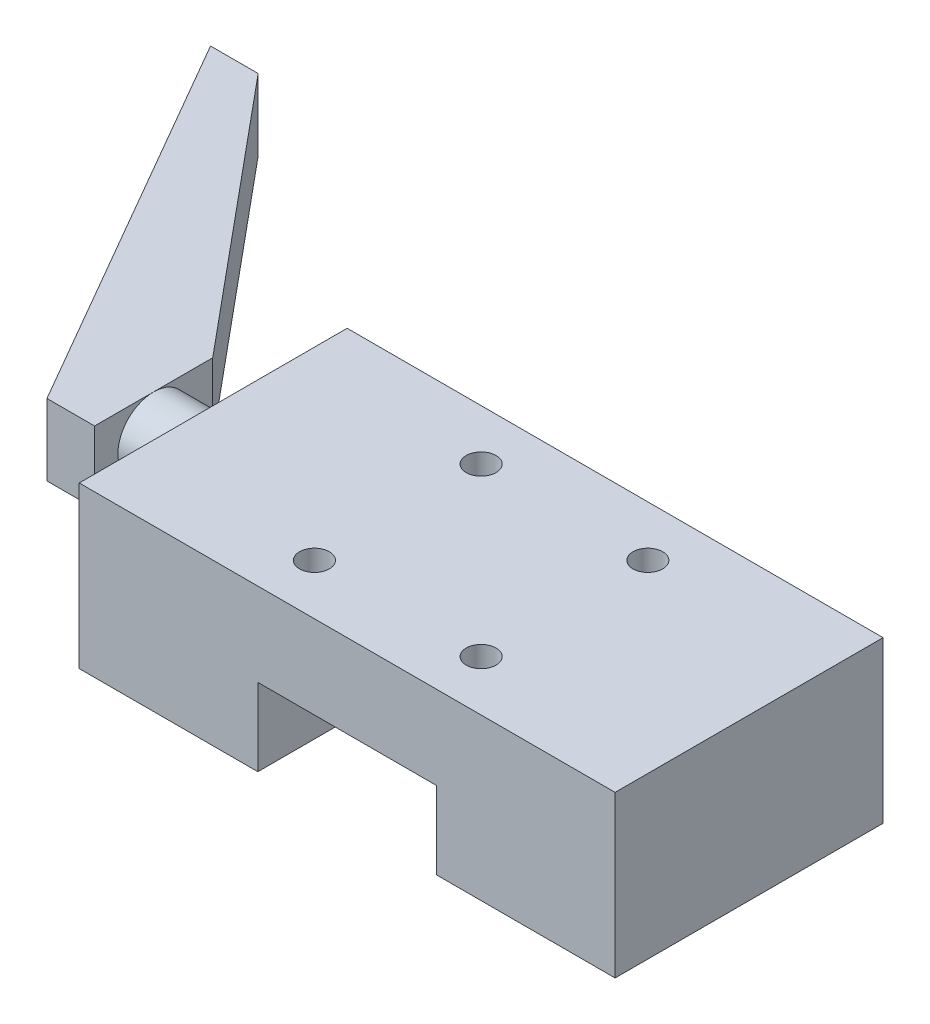
ISO-10303-21;
HEADER;
FILE_DESCRIPTION(('STEP AP214'),'2;1');
FILE_NAME('part.step','',(''),(''),'','','');
FILE_SCHEMA(('AUTOMOTIVE_DESIGN { 1 0 10303 214 1 1 1 1 }'));
ENDSEC;
DATA;
#1=APPLICATION_CONTEXT('core data for automotive mechanical design processes');
#2=APPLICATION_PROTOCOL_DEFINITION('international standard','automotive_design',2000,#1);
#3=PRODUCT_CONTEXT('',#1,'mechanical');
#4=PRODUCT('Part','Part','',(#3));
#5=PRODUCT_RELATED_PRODUCT_CATEGORY('part','',(#4));
#6=PRODUCT_DEFINITION_FORMATION('','',#4);
#7=PRODUCT_DEFINITION_CONTEXT('part definition',#1,'design');
#8=PRODUCT_DEFINITION('design','',#6,#7);
#9=PRODUCT_DEFINITION_SHAPE('','',#8);
#10=(LENGTH_UNIT() NAMED_UNIT(*) SI_UNIT(.MILLI.,.METRE.));
#11=(NAMED_UNIT(*) PLANE_ANGLE_UNIT() SI_UNIT($,.RADIAN.));
#12=(NAMED_UNIT(*) SI_UNIT($,.STERADIAN.) SOLID_ANGLE_UNIT());
#13=UNCERTAINTY_MEASURE_WITH_UNIT(LENGTH_MEASURE(1.E-05),#10,'distance_accuracy_value','');
#14=(GEOMETRIC_REPRESENTATION_CONTEXT(3) GLOBAL_UNCERTAINTY_ASSIGNED_CONTEXT((#13)) GLOBAL_UNIT_ASSIGNED_CONTEXT((#10,
#11,#12)) REPRESENTATION_CONTEXT('',''));
#15=CARTESIAN_POINT('',(0.,0.,0.));
#16=DIRECTION('',(0.,0.,1.));
#17=DIRECTION('',(1.,0.,0.));
#18=AXIS2_PLACEMENT_3D('',#15,#16,#17);
#19=CARTESIAN_POINT('',(-45.,-13.5,45.));
#20=DIRECTION('',(0.,1.,0.));
#21=DIRECTION('',(0.,0.,1.));
#22=AXIS2_PLACEMENT_3D('',#19,#20,#21);
#23=PLANE('',#22);
#24=DIRECTION('',(1.,0.,0.));
#25=VECTOR('',#24,1.);
#26=CARTESIAN_POINT('',(-45.,-13.5,45.));
#27=LINE('',#26,#25);
#28=CARTESIAN_POINT('',(15.,-13.5,45.));
#29=VERTEX_POINT('',#28);
#30=CARTESIAN_POINT('',(45.,-13.5,45.));
#31=VERTEX_POINT('',#30);
#32=EDGE_CURVE('E243',#29,#31,#27,.T.);
#33=ORIENTED_EDGE('',*,*,#32,.F.);
#34=DIRECTION('',(0.,0.,-1.));
#35=VECTOR('',#34,1.);
#36=CARTESIAN_POINT('',(15.,-13.5,45.));
#37=LINE('',#36,#35);
#38=CARTESIAN_POINT('',(15.,-13.5,0.));
#39=VERTEX_POINT('',#38);
#40=EDGE_CURVE('E231',#29,#39,#37,.T.);
#41=ORIENTED_EDGE('',*,*,#40,.T.);
#42=DIRECTION('',(1.,0.,0.));
#43=VECTOR('',#42,1.);
#44=CARTESIAN_POINT('',(-45.,-13.5,0.));
#45=LINE('',#44,#43);
#46=CARTESIAN_POINT('',(45.,-13.5,0.));
#47=VERTEX_POINT('',#46);
#48=EDGE_CURVE('E254',#39,#47,#45,.T.);
#49=ORIENTED_EDGE('',*,*,#48,.T.);
#50=DIRECTION('',(0.,0.,-1.));
#51=VECTOR('',#50,1.);
#52=CARTESIAN_POINT('',(45.,-13.5,45.));
#53=LINE('',#52,#51);
#54=EDGE_CURVE('E247',#31,#47,#53,.T.);
#55=ORIENTED_EDGE('',*,*,#54,.F.);
#56=EDGE_LOOP('',(#33,#41,#49,#55));
#57=FACE_BOUND('',#56,.T.);
#58=ADVANCED_FACE('F41',(#57),#23,.F.);
#59=CARTESIAN_POINT('',(45.,13.5,45.));
#60=DIRECTION('',(-1.,0.,0.));
#61=DIRECTION('',(0.,0.,1.));
#62=AXIS2_PLACEMENT_3D('',#59,#60,#61);
#63=PLANE('',#62);
#64=DIRECTION('',(0.,1.,0.));
#65=VECTOR('',#64,1.);
#66=CARTESIAN_POINT('',(45.,13.5,0.));
#67=LINE('',#66,#65);
#68=CARTESIAN_POINT('',(45.,13.5,0.));
#69=VERTEX_POINT('',#68);
#70=EDGE_CURVE('E234',#47,#69,#67,.T.);
#71=ORIENTED_EDGE('',*,*,#70,.T.);
#72=DIRECTION('',(0.,0.,-1.));
#73=VECTOR('',#72,1.);
#74=CARTESIAN_POINT('',(45.,13.5,45.));
#75=LINE('',#74,#73);
#76=CARTESIAN_POINT('',(45.,13.5,45.));
#77=VERTEX_POINT('',#76);
#78=EDGE_CURVE('E264',#77,#69,#75,.T.);
#79=ORIENTED_EDGE('',*,*,#78,.F.);
#80=DIRECTION('',(0.,1.,0.));
#81=VECTOR('',#80,1.);
#82=CARTESIAN_POINT('',(45.,13.5,45.));
#83=LINE('',#82,#81);
#84=EDGE_CURVE('E235',#31,#77,#83,.T.);
#85=ORIENTED_EDGE('',*,*,#84,.F.);
#86=ORIENTED_EDGE('',*,*,#54,.T.);
#87=EDGE_LOOP('',(#71,#79,#85,#86));
#88=FACE_BOUND('',#87,.T.);
#89=ADVANCED_FACE('F43',(#88),#63,.F.);
#90=CARTESIAN_POINT('',(-45.,13.5,45.));
#91=DIRECTION('',(0.,-1.,0.));
#92=DIRECTION('',(0.,0.,-1.));
#93=AXIS2_PLACEMENT_3D('',#90,#91,#92);
#94=PLANE('',#93);
#95=CARTESIAN_POINT('',(-14.,13.5,8.49999999999999));
#96=DIRECTION('',(0.,1.,0.));
#97=DIRECTION('',(0.,0.,1.));
#98=AXIS2_PLACEMENT_3D('',#95,#96,#97);
#99=CIRCLE('',#98,2.49999999999999);
#100=CARTESIAN_POINT('',(-14.,13.5,11.));
#101=VERTEX_POINT('',#100);
#102=EDGE_CURVE('E187',#101,#101,#99,.T.);
#103=ORIENTED_EDGE('',*,*,#102,.F.);
#104=EDGE_LOOP('',(#103));
#105=FACE_BOUND('',#104,.T.);
#106=CARTESIAN_POINT('',(14.,13.5,8.49999999999999));
#107=DIRECTION('',(0.,1.,0.));
#108=DIRECTION('',(0.,0.,1.));
#109=AXIS2_PLACEMENT_3D('',#106,#107,#108);
#110=CIRCLE('',#109,2.49999999999999);
#111=CARTESIAN_POINT('',(14.,13.5,11.));
#112=VERTEX_POINT('',#111);
#113=EDGE_CURVE('E194',#112,#112,#110,.T.);
#114=ORIENTED_EDGE('',*,*,#113,.F.);
#115=EDGE_LOOP('',(#114));
#116=FACE_BOUND('',#115,.T.);
#117=CARTESIAN_POINT('',(14.,13.5,36.5));
#118=DIRECTION('',(0.,1.,0.));
#119=DIRECTION('',(0.,0.,1.));
#120=AXIS2_PLACEMENT_3D('',#117,#118,#119);
#121=CIRCLE('',#120,2.49999999999999);
#122=CARTESIAN_POINT('',(14.,13.5,39.));
#123=VERTEX_POINT('',#122);
#124=EDGE_CURVE('E200',#123,#123,#121,.T.);
#125=ORIENTED_EDGE('',*,*,#124,.F.);
#126=EDGE_LOOP('',(#125));
#127=FACE_BOUND('',#126,.T.);
#128=CARTESIAN_POINT('',(-14.,13.5,36.5));
#129=DIRECTION('',(0.,1.,0.));
#130=DIRECTION('',(0.,0.,1.));
#131=AXIS2_PLACEMENT_3D('',#128,#129,#130);
#132=CIRCLE('',#131,2.49999999999999);
#133=CARTESIAN_POINT('',(-14.,13.5,39.));
#134=VERTEX_POINT('',#133);
#135=EDGE_CURVE('E206',#134,#134,#132,.T.);
#136=ORIENTED_EDGE('',*,*,#135,.F.);
#137=EDGE_LOOP('',(#136));
#138=FACE_BOUND('',#137,.T.);
#139=DIRECTION('',(-1.,0.,0.));
#140=VECTOR('',#139,1.);
#141=CARTESIAN_POINT('',(-45.,13.5,0.));
#142=LINE('',#141,#140);
#143=CARTESIAN_POINT('',(-45.,13.5,0.));
#144=VERTEX_POINT('',#143);
#145=EDGE_CURVE('E250',#69,#144,#142,.T.);
#146=ORIENTED_EDGE('',*,*,#145,.T.);
#147=DIRECTION('',(0.,0.,-1.));
#148=VECTOR('',#147,1.);
#149=CARTESIAN_POINT('',(-45.,13.5,45.));
#150=LINE('',#149,#148);
#151=CARTESIAN_POINT('',(-45.,13.5,45.));
#152=VERTEX_POINT('',#151);
#153=EDGE_CURVE('E262',#152,#144,#150,.T.);
#154=ORIENTED_EDGE('',*,*,#153,.F.);
#155=DIRECTION('',(-1.,0.,0.));
#156=VECTOR('',#155,1.);
#157=CARTESIAN_POINT('',(-45.,13.5,45.));
#158=LINE('',#157,#156);
#159=EDGE_CURVE('E238',#77,#152,#158,.T.);
#160=ORIENTED_EDGE('',*,*,#159,.F.);
#161=ORIENTED_EDGE('',*,*,#78,.T.);
#162=EDGE_LOOP('',(#146,#154,#160,#161));
#163=FACE_BOUND('',#162,.T.);
#164=ADVANCED_FACE('F298',(#105,#116,#127,#138,#163),#94,.F.);
#165=CARTESIAN_POINT('',(-45.,13.5,45.));
#166=DIRECTION('',(1.,0.,0.));
#167=DIRECTION('',(0.,0.,-1.));
#168=AXIS2_PLACEMENT_3D('',#165,#166,#167);
#169=PLANE('',#168);
#170=CARTESIAN_POINT('',(-45.,4.5,22.5));
#171=DIRECTION('',(-1.,0.,0.));
#172=DIRECTION('',(0.,0.,1.));
#173=AXIS2_PLACEMENT_3D('',#170,#171,#172);
#174=CIRCLE('',#173,6.);
#175=CARTESIAN_POINT('',(-45.,4.5,28.5));
#176=VERTEX_POINT('',#175);
#177=EDGE_CURVE('E11',#176,#176,#174,.T.);
#178=ORIENTED_EDGE('',*,*,#177,.F.);
#179=EDGE_LOOP('',(#178));
#180=FACE_BOUND('',#179,.T.);
#181=DIRECTION('',(0.,-1.,0.));
#182=VECTOR('',#181,1.);
#183=CARTESIAN_POINT('',(-45.,13.5,0.));
#184=LINE('',#183,#182);
#185=CARTESIAN_POINT('',(-45.,-13.5,0.));
#186=VERTEX_POINT('',#185);
#187=EDGE_CURVE('E252',#144,#186,#184,.T.);
#188=ORIENTED_EDGE('',*,*,#187,.T.);
#189=DIRECTION('',(0.,0.,-1.));
#190=VECTOR('',#189,1.);
#191=CARTESIAN_POINT('',(-45.,-13.5,45.));
#192=LINE('',#191,#190);
#193=CARTESIAN_POINT('',(-45.,-13.5,45.));
#194=VERTEX_POINT('',#193);
#195=EDGE_CURVE('E259',#194,#186,#192,.T.);
#196=ORIENTED_EDGE('',*,*,#195,.F.);
#197=DIRECTION('',(0.,-1.,0.));
#198=VECTOR('',#197,1.);
#199=CARTESIAN_POINT('',(-45.,13.5,45.));
#200=LINE('',#199,#198);
#201=EDGE_CURVE('E241',#152,#194,#200,.T.);
#202=ORIENTED_EDGE('',*,*,#201,.F.);
#203=ORIENTED_EDGE('',*,*,#153,.T.);
#204=EDGE_LOOP('',(#188,#196,#202,#203));
#205=FACE_BOUND('',#204,.T.);
#206=ADVANCED_FACE('F296',(#180,#205),#169,.F.);
#207=CARTESIAN_POINT('',(-15.,-13.5,0.));
#208=VERTEX_POINT('',#207);
#209=EDGE_CURVE('E239',#186,#208,#45,.T.);
#210=ORIENTED_EDGE('',*,*,#209,.T.);
#211=DIRECTION('',(0.,0.,1.));
#212=VECTOR('',#211,1.);
#213=CARTESIAN_POINT('',(-15.,-13.5,45.));
#214=LINE('',#213,#212);
#215=CARTESIAN_POINT('',(-15.,-13.5,45.));
#216=VERTEX_POINT('',#215);
#217=EDGE_CURVE('E226',#208,#216,#214,.T.);
#218=ORIENTED_EDGE('',*,*,#217,.T.);
#219=EDGE_CURVE('E244',#194,#216,#27,.T.);
#220=ORIENTED_EDGE('',*,*,#219,.F.);
#221=ORIENTED_EDGE('',*,*,#195,.T.);
#222=EDGE_LOOP('',(#210,#218,#220,#221));
#223=FACE_BOUND('',#222,.T.);
#224=ADVANCED_FACE('F290',(#223),#23,.F.);
#225=CARTESIAN_POINT('',(0.,0.,45.));
#226=DIRECTION('',(0.,0.,1.));
#227=DIRECTION('',(1.,0.,0.));
#228=AXIS2_PLACEMENT_3D('',#225,#226,#227);
#229=PLANE('',#228);
#230=DIRECTION('',(0.,1.,0.));
#231=VECTOR('',#230,1.);
#232=CARTESIAN_POINT('',(15.,-0.500000000000001,45.));
#233=LINE('',#232,#231);
#234=CARTESIAN_POINT('',(15.,-0.500000000000001,45.));
#235=VERTEX_POINT('',#234);
#236=EDGE_CURVE('E212',#29,#235,#233,.T.);
#237=ORIENTED_EDGE('',*,*,#236,.F.);
#238=ORIENTED_EDGE('',*,*,#32,.T.);
#239=ORIENTED_EDGE('',*,*,#84,.T.);
#240=ORIENTED_EDGE('',*,*,#159,.T.);
#241=ORIENTED_EDGE('',*,*,#201,.T.);
#242=ORIENTED_EDGE('',*,*,#219,.T.);
#243=DIRECTION('',(0.,-1.,0.));
#244=VECTOR('',#243,1.);
#245=CARTESIAN_POINT('',(-15.,-0.500000000000001,45.));
#246=LINE('',#245,#244);
#247=CARTESIAN_POINT('',(-15.,-0.500000000000001,45.));
#248=VERTEX_POINT('',#247);
#249=EDGE_CURVE('E216',#248,#216,#246,.T.);
#250=ORIENTED_EDGE('',*,*,#249,.F.);
#251=DIRECTION('',(-1.,0.,0.));
#252=VECTOR('',#251,1.);
#253=CARTESIAN_POINT('',(-15.,-0.500000000000001,45.));
#254=LINE('',#253,#252);
#255=EDGE_CURVE('E220',#235,#248,#254,.T.);
#256=ORIENTED_EDGE('',*,*,#255,.F.);
#257=EDGE_LOOP('',(#237,#238,#239,#240,#241,#242,#250,#256));
#258=FACE_BOUND('',#257,.T.);
#259=ADVANCED_FACE('F282',(#258),#229,.T.);
#260=CARTESIAN_POINT('',(0.,0.,0.));
#261=DIRECTION('',(0.,0.,1.));
#262=DIRECTION('',(1.,0.,0.));
#263=AXIS2_PLACEMENT_3D('',#260,#261,#262);
#264=PLANE('',#263);
#265=ORIENTED_EDGE('',*,*,#48,.F.);
#266=DIRECTION('',(0.,1.,0.));
#267=VECTOR('',#266,1.);
#268=CARTESIAN_POINT('',(15.,0.,0.));
#269=LINE('',#268,#267);
#270=CARTESIAN_POINT('',(15.,-0.500000000000001,0.));
#271=VERTEX_POINT('',#270);
#272=EDGE_CURVE('E45',#39,#271,#269,.T.);
#273=ORIENTED_EDGE('',*,*,#272,.T.);
#274=DIRECTION('',(-1.,0.,0.));
#275=VECTOR('',#274,1.);
#276=CARTESIAN_POINT('',(-15.,-0.500000000000001,0.));
#277=LINE('',#276,#275);
#278=CARTESIAN_POINT('',(-15.,-0.500000000000001,0.));
#279=VERTEX_POINT('',#278);
#280=EDGE_CURVE('E213',#271,#279,#277,.T.);
#281=ORIENTED_EDGE('',*,*,#280,.T.);
#282=DIRECTION('',(0.,-1.,0.));
#283=VECTOR('',#282,1.);
#284=CARTESIAN_POINT('',(-15.,-0.500000000000001,0.));
#285=LINE('',#284,#283);
#286=EDGE_CURVE('E64',#279,#208,#285,.T.);
#287=ORIENTED_EDGE('',*,*,#286,.T.);
#288=ORIENTED_EDGE('',*,*,#209,.F.);
#289=ORIENTED_EDGE('',*,*,#187,.F.);
#290=ORIENTED_EDGE('',*,*,#145,.F.);
#291=ORIENTED_EDGE('',*,*,#70,.F.);
#292=EDGE_LOOP('',(#265,#273,#281,#287,#288,#289,#290,#291));
#293=FACE_BOUND('',#292,.T.);
#294=ADVANCED_FACE('F271',(#293),#264,.F.);
#295=CARTESIAN_POINT('',(15.,-0.500000000000001,0.));
#296=DIRECTION('',(1.,0.,0.));
#297=DIRECTION('',(0.,0.,-1.));
#298=AXIS2_PLACEMENT_3D('',#295,#296,#297);
#299=PLANE('',#298);
#300=ORIENTED_EDGE('',*,*,#236,.T.);
#301=DIRECTION('',(0.,0.,1.));
#302=VECTOR('',#301,1.);
#303=CARTESIAN_POINT('',(15.,-0.500000000000001,0.));
#304=LINE('',#303,#302);
#305=EDGE_CURVE('E218',#271,#235,#304,.T.);
#306=ORIENTED_EDGE('',*,*,#305,.F.);
#307=ORIENTED_EDGE('',*,*,#272,.F.);
#308=ORIENTED_EDGE('',*,*,#40,.F.);
#309=EDGE_LOOP('',(#300,#306,#307,#308));
#310=FACE_BOUND('',#309,.T.);
#311=ADVANCED_FACE('F275',(#310),#299,.F.);
#312=CARTESIAN_POINT('',(-15.,-0.500000000000001,0.));
#313=DIRECTION('',(-1.,0.,0.));
#314=DIRECTION('',(0.,-1.,0.));
#315=AXIS2_PLACEMENT_3D('',#312,#313,#314);
#316=PLANE('',#315);
#317=ORIENTED_EDGE('',*,*,#286,.F.);
#318=DIRECTION('',(0.,0.,1.));
#319=VECTOR('',#318,1.);
#320=CARTESIAN_POINT('',(-15.,-0.500000000000001,0.));
#321=LINE('',#320,#319);
#322=EDGE_CURVE('E224',#279,#248,#321,.T.);
#323=ORIENTED_EDGE('',*,*,#322,.T.);
#324=ORIENTED_EDGE('',*,*,#249,.T.);
#325=ORIENTED_EDGE('',*,*,#217,.F.);
#326=EDGE_LOOP('',(#317,#323,#324,#325));
#327=FACE_BOUND('',#326,.T.);
#328=ADVANCED_FACE('F287',(#327),#316,.F.);
#329=CARTESIAN_POINT('',(-15.,-0.500000000000001,0.));
#330=DIRECTION('',(0.,1.,0.));
#331=DIRECTION('',(0.,0.,1.));
#332=AXIS2_PLACEMENT_3D('',#329,#330,#331);
#333=PLANE('',#332);
#334=ORIENTED_EDGE('',*,*,#255,.T.);
#335=ORIENTED_EDGE('',*,*,#322,.F.);
#336=ORIENTED_EDGE('',*,*,#280,.F.);
#337=ORIENTED_EDGE('',*,*,#305,.T.);
#338=EDGE_LOOP('',(#334,#335,#336,#337));
#339=FACE_BOUND('',#338,.T.);
#340=ADVANCED_FACE('F286',(#339),#333,.F.);
#341=CARTESIAN_POINT('',(-14.,2.5,36.5));
#342=DIRECTION('',(0.,1.,0.));
#343=DIRECTION('',(0.,0.,1.));
#344=AXIS2_PLACEMENT_3D('',#341,#342,#343);
#345=CONICAL_SURFACE('',#344,2.5,1.02974425867665);
#346=CARTESIAN_POINT('',(-14.,0.9978484524311,36.5));
#347=VERTEX_POINT('',#346);
#348=VERTEX_LOOP('',#347);
#349=FACE_BOUND('',#348,.T.);
#350=CARTESIAN_POINT('',(-14.,2.5,36.5));
#351=DIRECTION('',(0.,1.,0.));
#352=DIRECTION('',(0.,0.,1.));
#353=AXIS2_PLACEMENT_3D('',#350,#351,#352);
#354=CIRCLE('',#353,2.5);
#355=CARTESIAN_POINT('',(-14.,2.5,39.));
#356=VERTEX_POINT('',#355);
#357=EDGE_CURVE('E209',#356,#356,#354,.T.);
#358=ORIENTED_EDGE('',*,*,#357,.T.);
#359=EDGE_LOOP('',(#358));
#360=FACE_BOUND('',#359,.T.);
#361=ADVANCED_FACE('F328',(#349,#360),#345,.F.);
#362=CARTESIAN_POINT('',(-14.,13.5,36.5));
#363=DIRECTION('',(0.,1.,0.));
#364=DIRECTION('',(0.,0.,1.));
#365=AXIS2_PLACEMENT_3D('',#362,#363,#364);
#366=CYLINDRICAL_SURFACE('',#365,2.49999999999999);
#367=ORIENTED_EDGE('',*,*,#357,.F.);
#368=EDGE_LOOP('',(#367));
#369=FACE_BOUND('',#368,.T.);
#370=ORIENTED_EDGE('',*,*,#135,.T.);
#371=EDGE_LOOP('',(#370));
#372=FACE_BOUND('',#371,.T.);
#373=ADVANCED_FACE('F333',(#369,#372),#366,.F.);
#374=CARTESIAN_POINT('',(14.,2.5,36.5));
#375=DIRECTION('',(0.,1.,0.));
#376=DIRECTION('',(0.,0.,1.));
#377=AXIS2_PLACEMENT_3D('',#374,#375,#376);
#378=CONICAL_SURFACE('',#377,2.5,1.02974425867665);
#379=CARTESIAN_POINT('',(14.,0.9978484524311,36.5));
#380=VERTEX_POINT('',#379);
#381=VERTEX_LOOP('',#380);
#382=FACE_BOUND('',#381,.T.);
#383=CARTESIAN_POINT('',(14.,2.5,36.5));
#384=DIRECTION('',(0.,1.,0.));
#385=DIRECTION('',(0.,0.,1.));
#386=AXIS2_PLACEMENT_3D('',#383,#384,#385);
#387=CIRCLE('',#386,2.5);
#388=CARTESIAN_POINT('',(14.,2.5,39.));
#389=VERTEX_POINT('',#388);
#390=EDGE_CURVE('E203',#389,#389,#387,.T.);
#391=ORIENTED_EDGE('',*,*,#390,.T.);
#392=EDGE_LOOP('',(#391));
#393=FACE_BOUND('',#392,.T.);
#394=ADVANCED_FACE('F337',(#382,#393),#378,.F.);
#395=CARTESIAN_POINT('',(14.,13.5,36.5));
#396=DIRECTION('',(0.,1.,0.));
#397=DIRECTION('',(0.,0.,1.));
#398=AXIS2_PLACEMENT_3D('',#395,#396,#397);
#399=CYLINDRICAL_SURFACE('',#398,2.5);
#400=ORIENTED_EDGE('',*,*,#390,.F.);
#401=EDGE_LOOP('',(#400));
#402=FACE_BOUND('',#401,.T.);
#403=ORIENTED_EDGE('',*,*,#124,.T.);
#404=EDGE_LOOP('',(#403));
#405=FACE_BOUND('',#404,.T.);
#406=ADVANCED_FACE('F341',(#402,#405),#399,.F.);
#407=CARTESIAN_POINT('',(14.,2.5,8.49999999999999));
#408=DIRECTION('',(0.,1.,0.));
#409=DIRECTION('',(0.,0.,1.));
#410=AXIS2_PLACEMENT_3D('',#407,#408,#409);
#411=CONICAL_SURFACE('',#410,2.5,1.02974425867665);
#412=CARTESIAN_POINT('',(14.,0.9978484524311,8.49999999999999));
#413=VERTEX_POINT('',#412);
#414=VERTEX_LOOP('',#413);
#415=FACE_BOUND('',#414,.T.);
#416=CARTESIAN_POINT('',(14.,2.5,8.49999999999999));
#417=DIRECTION('',(0.,1.,0.));
#418=DIRECTION('',(0.,0.,1.));
#419=AXIS2_PLACEMENT_3D('',#416,#417,#418);
#420=CIRCLE('',#419,2.5);
#421=CARTESIAN_POINT('',(14.,2.5,11.));
#422=VERTEX_POINT('',#421);
#423=EDGE_CURVE('E197',#422,#422,#420,.T.);
#424=ORIENTED_EDGE('',*,*,#423,.T.);
#425=EDGE_LOOP('',(#424));
#426=FACE_BOUND('',#425,.T.);
#427=ADVANCED_FACE('F345',(#415,#426),#411,.F.);
#428=CARTESIAN_POINT('',(14.,13.5,8.49999999999999));
#429=DIRECTION('',(0.,1.,0.));
#430=DIRECTION('',(0.,0.,1.));
#431=AXIS2_PLACEMENT_3D('',#428,#429,#430);
#432=CYLINDRICAL_SURFACE('',#431,2.5);
#433=ORIENTED_EDGE('',*,*,#423,.F.);
#434=EDGE_LOOP('',(#433));
#435=FACE_BOUND('',#434,.T.);
#436=ORIENTED_EDGE('',*,*,#113,.T.);
#437=EDGE_LOOP('',(#436));
#438=FACE_BOUND('',#437,.T.);
#439=ADVANCED_FACE('F349',(#435,#438),#432,.F.);
#440=CARTESIAN_POINT('',(-14.,2.5,8.49999999999999));
#441=DIRECTION('',(0.,1.,0.));
#442=DIRECTION('',(0.,0.,1.));
#443=AXIS2_PLACEMENT_3D('',#440,#441,#442);
#444=CONICAL_SURFACE('',#443,2.5,1.02974425867665);
#445=CARTESIAN_POINT('',(-14.,0.9978484524311,8.49999999999999));
#446=VERTEX_POINT('',#445);
#447=VERTEX_LOOP('',#446);
#448=FACE_BOUND('',#447,.T.);
#449=CARTESIAN_POINT('',(-14.,2.5,8.49999999999999));
#450=DIRECTION('',(0.,1.,0.));
#451=DIRECTION('',(0.,0.,1.));
#452=AXIS2_PLACEMENT_3D('',#449,#450,#451);
#453=CIRCLE('',#452,2.5);
#454=CARTESIAN_POINT('',(-14.,2.5,11.));
#455=VERTEX_POINT('',#454);
#456=EDGE_CURVE('E191',#455,#455,#453,.T.);
#457=ORIENTED_EDGE('',*,*,#456,.T.);
#458=EDGE_LOOP('',(#457));
#459=FACE_BOUND('',#458,.T.);
#460=ADVANCED_FACE('F353',(#448,#459),#444,.F.);
#461=CARTESIAN_POINT('',(-14.,13.5,8.49999999999999));
#462=DIRECTION('',(0.,1.,0.));
#463=DIRECTION('',(0.,0.,1.));
#464=AXIS2_PLACEMENT_3D('',#461,#462,#463);
#465=CYLINDRICAL_SURFACE('',#464,2.49999999999999);
#466=ORIENTED_EDGE('',*,*,#456,.F.);
#467=EDGE_LOOP('',(#466));
#468=FACE_BOUND('',#467,.T.);
#469=ORIENTED_EDGE('',*,*,#102,.T.);
#470=EDGE_LOOP('',(#469));
#471=FACE_BOUND('',#470,.T.);
#472=ADVANCED_FACE('F357',(#468,#471),#465,.F.);
#473=CARTESIAN_POINT('',(-55.,4.5,22.5));
#474=DIRECTION('',(1.,0.,0.));
#475=DIRECTION('',(0.,0.,-1.));
#476=AXIS2_PLACEMENT_3D('',#473,#474,#475);
#477=CYLINDRICAL_SURFACE('',#476,6.);
#478=CARTESIAN_POINT('',(-55.,4.5,22.5));
#479=DIRECTION('',(-1.,0.,0.));
#480=DIRECTION('',(0.,0.,1.));
#481=AXIS2_PLACEMENT_3D('',#478,#479,#480);
#482=CIRCLE('',#481,6.);
#483=CARTESIAN_POINT('',(-55.,10.5,22.5));
#484=VERTEX_POINT('',#483);
#485=CARTESIAN_POINT('',(-55.,-1.5,22.5));
#486=VERTEX_POINT('',#485);
#487=EDGE_CURVE('E182',#484,#486,#482,.T.);
#488=ORIENTED_EDGE('',*,*,#487,.F.);
#489=EDGE_CURVE('E56',#486,#484,#482,.T.);
#490=ORIENTED_EDGE('',*,*,#489,.F.);
#491=EDGE_LOOP('',(#488,#490));
#492=FACE_BOUND('',#491,.T.);
#493=ORIENTED_EDGE('',*,*,#177,.T.);
#494=EDGE_LOOP('',(#493));
#495=FACE_BOUND('',#494,.T.);
#496=ADVANCED_FACE('F361',(#492,#495),#477,.T.);
#497=CARTESIAN_POINT('',(-55.,10.5,32.420186034113));
#498=DIRECTION('',(-1.,0.,0.));
#499=DIRECTION('',(0.,0.,1.));
#500=AXIS2_PLACEMENT_3D('',#497,#498,#499);
#501=PLANE('',#500);
#502=DIRECTION('',(0.,0.,-1.));
#503=VECTOR('',#502,1.);
#504=CARTESIAN_POINT('',(-55.,10.5,32.420186034113));
#505=LINE('',#504,#503);
#506=CARTESIAN_POINT('',(-55.,10.5,12.579813965887));
#507=VERTEX_POINT('',#506);
#508=EDGE_CURVE('E172',#484,#507,#505,.T.);
#509=ORIENTED_EDGE('',*,*,#508,.F.);
#510=ORIENTED_EDGE('',*,*,#487,.T.);
#511=DIRECTION('',(0.,0.,-1.));
#512=VECTOR('',#511,1.);
#513=CARTESIAN_POINT('',(-55.,-1.5,32.420186034113));
#514=LINE('',#513,#512);
#515=CARTESIAN_POINT('',(-55.,-1.5,12.579813965887));
#516=VERTEX_POINT('',#515);
#517=EDGE_CURVE('E599',#486,#516,#514,.T.);
#518=ORIENTED_EDGE('',*,*,#517,.T.);
#519=DIRECTION('',(0.,-1.,0.));
#520=VECTOR('',#519,1.);
#521=CARTESIAN_POINT('',(-55.,10.5,12.579813965887));
#522=LINE('',#521,#520);
#523=EDGE_CURVE('E605',#507,#516,#522,.T.);
#524=ORIENTED_EDGE('',*,*,#523,.F.);
#525=EDGE_LOOP('',(#509,#510,#518,#524));
#526=FACE_BOUND('',#525,.T.);
#527=ADVANCED_FACE('F365',(#526),#501,.F.);
#528=CARTESIAN_POINT('',(-55.,-1.5,32.420186034113));
#529=VERTEX_POINT('',#528);
#530=EDGE_CURVE('E176',#529,#486,#514,.T.);
#531=ORIENTED_EDGE('',*,*,#530,.T.);
#532=ORIENTED_EDGE('',*,*,#489,.T.);
#533=CARTESIAN_POINT('',(-55.,10.5,32.420186034113));
#534=VERTEX_POINT('',#533);
#535=EDGE_CURVE('E607',#534,#484,#505,.T.);
#536=ORIENTED_EDGE('',*,*,#535,.F.);
#537=DIRECTION('',(0.,-1.,0.));
#538=VECTOR('',#537,1.);
#539=CARTESIAN_POINT('',(-55.,10.5,32.420186034113));
#540=LINE('',#539,#538);
#541=EDGE_CURVE('E596',#534,#529,#540,.T.);
#542=ORIENTED_EDGE('',*,*,#541,.T.);
#543=EDGE_LOOP('',(#531,#532,#536,#542));
#544=FACE_BOUND('',#543,.T.);
#545=ADVANCED_FACE('F368',(#544),#501,.F.);
#546=CARTESIAN_POINT('',(-92.5277674973258,10.5,-32.579813965887));
#547=DIRECTION('',(-0.769102150068047,0.,0.639125873956537));
#548=DIRECTION('',(0.639125873956537,0.,0.769102150068047));
#549=AXIS2_PLACEMENT_3D('',#546,#547,#548);
#550=PLANE('',#549);
#551=DIRECTION('',(-0.639125873956537,0.,-0.769102150068047));
#552=VECTOR('',#551,1.);
#553=CARTESIAN_POINT('',(-92.5277674973258,-1.5,-32.579813965887));
#554=LINE('',#553,#552);
#555=CARTESIAN_POINT('',(-92.5277674973258,-1.5,-32.579813965887));
#556=VERTEX_POINT('',#555);
#557=EDGE_CURVE('E180',#516,#556,#554,.T.);
#558=ORIENTED_EDGE('',*,*,#557,.T.);
#559=DIRECTION('',(0.,-1.,0.));
#560=VECTOR('',#559,1.);
#561=CARTESIAN_POINT('',(-92.5277674973258,10.5,-32.579813965887));
#562=LINE('',#561,#560);
#563=CARTESIAN_POINT('',(-92.5277674973258,10.5,-32.579813965887));
#564=VERTEX_POINT('',#563);
#565=EDGE_CURVE('E159',#564,#556,#562,.T.);
#566=ORIENTED_EDGE('',*,*,#565,.F.);
#567=DIRECTION('',(-0.639125873956537,0.,-0.769102150068047));
#568=VECTOR('',#567,1.);
#569=CARTESIAN_POINT('',(-92.5277674973258,10.5,-32.579813965887));
#570=LINE('',#569,#568);
#571=EDGE_CURVE('E166',#507,#564,#570,.T.);
#572=ORIENTED_EDGE('',*,*,#571,.F.);
#573=ORIENTED_EDGE('',*,*,#523,.T.);
#574=EDGE_LOOP('',(#558,#566,#572,#573));
#575=FACE_BOUND('',#574,.T.);
#576=ADVANCED_FACE('F178',(#575),#550,.F.);
#577=CARTESIAN_POINT('',(-100.527767497326,10.5,-32.5798139658869));
#578=DIRECTION('',(0.,0.,1.));
#579=DIRECTION('',(1.,0.,0.));
#580=AXIS2_PLACEMENT_3D('',#577,#578,#579);
#581=PLANE('',#580);
#582=DIRECTION('',(-1.,0.,0.));
#583=VECTOR('',#582,1.);
#584=CARTESIAN_POINT('',(-100.527767497326,-1.5,-32.5798139658869));
#585=LINE('',#584,#583);
#586=CARTESIAN_POINT('',(-100.527767497326,-1.5,-32.5798139658869));
#587=VERTEX_POINT('',#586);
#588=EDGE_CURVE('E614',#556,#587,#585,.T.);
#589=ORIENTED_EDGE('',*,*,#588,.T.);
#590=DIRECTION('',(0.,-1.,0.));
#591=VECTOR('',#590,1.);
#592=CARTESIAN_POINT('',(-100.527767497326,10.5,-32.5798139658869));
#593=LINE('',#592,#591);
#594=CARTESIAN_POINT('',(-100.527767497326,10.5,-32.5798139658869));
#595=VERTEX_POINT('',#594);
#596=EDGE_CURVE('E162',#595,#587,#593,.T.);
#597=ORIENTED_EDGE('',*,*,#596,.F.);
#598=DIRECTION('',(-1.,0.,0.));
#599=VECTOR('',#598,1.);
#600=CARTESIAN_POINT('',(-100.527767497326,10.5,-32.5798139658869));
#601=LINE('',#600,#599);
#602=EDGE_CURVE('E155',#564,#595,#601,.T.);
#603=ORIENTED_EDGE('',*,*,#602,.F.);
#604=ORIENTED_EDGE('',*,*,#565,.T.);
#605=EDGE_LOOP('',(#589,#597,#603,#604));
#606=FACE_BOUND('',#605,.T.);
#607=ADVANCED_FACE('F157',(#606),#581,.F.);
#608=CARTESIAN_POINT('',(-63.,10.5,32.420186034113));
#609=DIRECTION('',(0.866025403784438,0.,-0.500000000000001));
#610=DIRECTION('',(-0.500000000000001,0.,-0.866025403784438));
#611=AXIS2_PLACEMENT_3D('',#608,#609,#610);
#612=PLANE('',#611);
#613=DIRECTION('',(0.500000000000001,0.,0.866025403784438));
#614=VECTOR('',#613,1.);
#615=CARTESIAN_POINT('',(-63.,-1.5,32.420186034113));
#616=LINE('',#615,#614);
#617=CARTESIAN_POINT('',(-63.,-1.5,32.420186034113));
#618=VERTEX_POINT('',#617);
#619=EDGE_CURVE('E613',#587,#618,#616,.T.);
#620=ORIENTED_EDGE('',*,*,#619,.T.);
#621=DIRECTION('',(0.,-1.,0.));
#622=VECTOR('',#621,1.);
#623=CARTESIAN_POINT('',(-63.,10.5,32.420186034113));
#624=LINE('',#623,#622);
#625=CARTESIAN_POINT('',(-63.,10.5,32.420186034113));
#626=VERTEX_POINT('',#625);
#627=EDGE_CURVE('E184',#626,#618,#624,.T.);
#628=ORIENTED_EDGE('',*,*,#627,.F.);
#629=DIRECTION('',(0.500000000000001,0.,0.866025403784438));
#630=VECTOR('',#629,1.);
#631=CARTESIAN_POINT('',(-63.,10.5,32.420186034113));
#632=LINE('',#631,#630);
#633=EDGE_CURVE('E165',#595,#626,#632,.T.);
#634=ORIENTED_EDGE('',*,*,#633,.F.);
#635=ORIENTED_EDGE('',*,*,#596,.T.);
#636=EDGE_LOOP('',(#620,#628,#634,#635));
#637=FACE_BOUND('',#636,.T.);
#638=ADVANCED_FACE('F371',(#637),#612,.F.);
#639=CARTESIAN_POINT('',(-55.,10.5,32.420186034113));
#640=DIRECTION('',(0.,0.,-1.));
#641=DIRECTION('',(-1.,0.,0.));
#642=AXIS2_PLACEMENT_3D('',#639,#640,#641);
#643=PLANE('',#642);
#644=DIRECTION('',(1.,0.,0.));
#645=VECTOR('',#644,1.);
#646=CARTESIAN_POINT('',(-55.,-1.5,32.420186034113));
#647=LINE('',#646,#645);
#648=EDGE_CURVE('E601',#618,#529,#647,.T.);
#649=ORIENTED_EDGE('',*,*,#648,.T.);
#650=ORIENTED_EDGE('',*,*,#541,.F.);
#651=DIRECTION('',(1.,0.,0.));
#652=VECTOR('',#651,1.);
#653=CARTESIAN_POINT('',(-55.,10.5,32.420186034113));
#654=LINE('',#653,#652);
#655=EDGE_CURVE('E611',#626,#534,#654,.T.);
#656=ORIENTED_EDGE('',*,*,#655,.F.);
#657=ORIENTED_EDGE('',*,*,#627,.T.);
#658=EDGE_LOOP('',(#649,#650,#656,#657));
#659=FACE_BOUND('',#658,.T.);
#660=ADVANCED_FACE('F374',(#659),#643,.F.);
#661=CARTESIAN_POINT('',(0.,10.5,0.));
#662=DIRECTION('',(0.,-1.,0.));
#663=DIRECTION('',(0.,0.,-1.));
#664=AXIS2_PLACEMENT_3D('',#661,#662,#663);
#665=PLANE('',#664);
#666=ORIENTED_EDGE('',*,*,#571,.T.);
#667=ORIENTED_EDGE('',*,*,#602,.T.);
#668=ORIENTED_EDGE('',*,*,#633,.T.);
#669=ORIENTED_EDGE('',*,*,#655,.T.);
#670=ORIENTED_EDGE('',*,*,#535,.T.);
#671=ORIENTED_EDGE('',*,*,#508,.T.);
#672=EDGE_LOOP('',(#666,#667,#668,#669,#670,#671));
#673=FACE_BOUND('',#672,.T.);
#674=ADVANCED_FACE('F169',(#673),#665,.F.);
#675=CARTESIAN_POINT('',(0.,-1.5,0.));
#676=DIRECTION('',(0.,-1.,0.));
#677=DIRECTION('',(0.,0.,-1.));
#678=AXIS2_PLACEMENT_3D('',#675,#676,#677);
#679=PLANE('',#678);
#680=ORIENTED_EDGE('',*,*,#557,.F.);
#681=ORIENTED_EDGE('',*,*,#517,.F.);
#682=ORIENTED_EDGE('',*,*,#530,.F.);
#683=ORIENTED_EDGE('',*,*,#648,.F.);
#684=ORIENTED_EDGE('',*,*,#619,.F.);
#685=ORIENTED_EDGE('',*,*,#588,.F.);
#686=EDGE_LOOP('',(#680,#681,#682,#683,#684,#685));
#687=FACE_BOUND('',#686,.T.);
#688=ADVANCED_FACE('F382',(#687),#679,.T.);
#689=CLOSED_SHELL('',(#58,#89,#164,#206,#224,#259,#294,#311,#328,#340,#361,#373,#394,#406,#427,
#439,#460,#472,#496,#527,#545,#576,#607,#638,#660,#674,#688));
#690=MANIFOLD_SOLID_BREP('B2',#689);
#691=ADVANCED_BREP_SHAPE_REPRESENTATION('',(#18,#690),#14);
#692=SHAPE_DEFINITION_REPRESENTATION(#9,#691);
ENDSEC;
END-ISO-10303-21;
